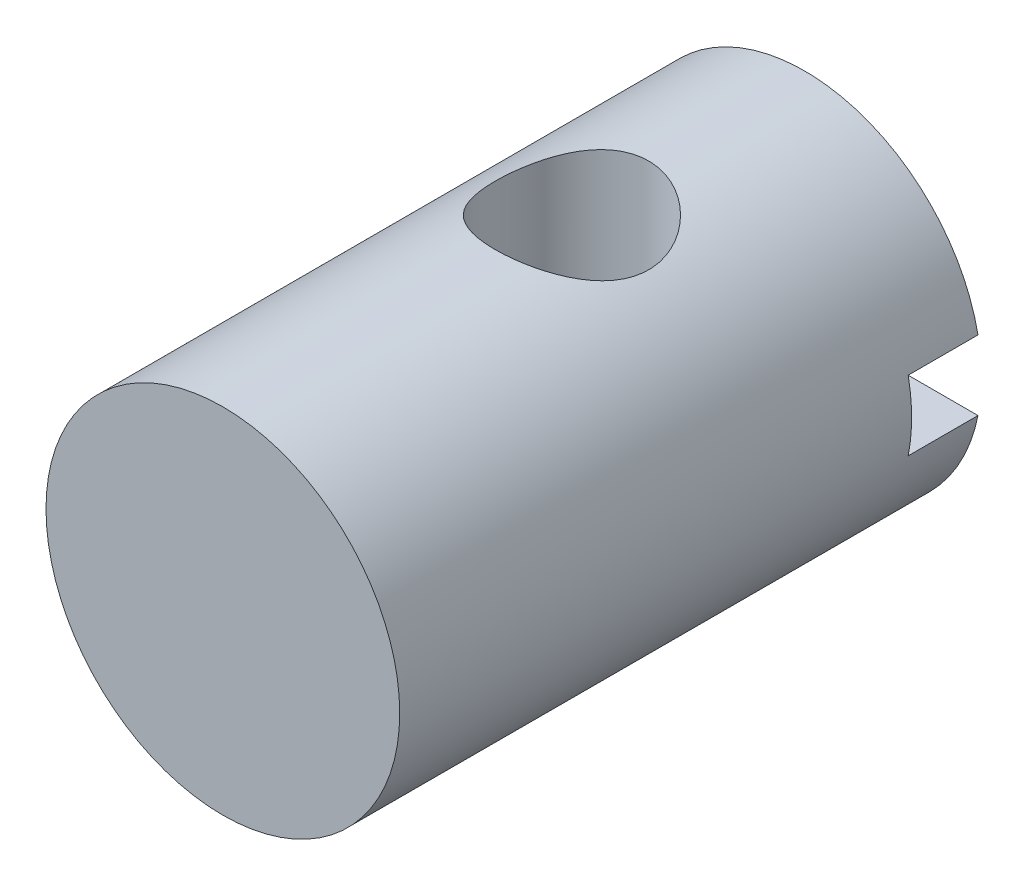
ISO-10303-21;
HEADER;
FILE_DESCRIPTION(('STEP AP214'),'2;1');
FILE_NAME('part.step','',(''),(''),'','','');
FILE_SCHEMA(('AUTOMOTIVE_DESIGN { 1 0 10303 214 1 1 1 1 }'));
ENDSEC;
DATA;
#1=APPLICATION_CONTEXT('core data for automotive mechanical design processes');
#2=APPLICATION_PROTOCOL_DEFINITION('international standard','automotive_design',2000,#1);
#3=PRODUCT_CONTEXT('',#1,'mechanical');
#4=PRODUCT('Part','Part','',(#3));
#5=PRODUCT_RELATED_PRODUCT_CATEGORY('part','',(#4));
#6=PRODUCT_DEFINITION_FORMATION('','',#4);
#7=PRODUCT_DEFINITION_CONTEXT('part definition',#1,'design');
#8=PRODUCT_DEFINITION('design','',#6,#7);
#9=PRODUCT_DEFINITION_SHAPE('','',#8);
#10=(LENGTH_UNIT() NAMED_UNIT(*) SI_UNIT(.MILLI.,.METRE.));
#11=(NAMED_UNIT(*) PLANE_ANGLE_UNIT() SI_UNIT($,.RADIAN.));
#12=(NAMED_UNIT(*) SI_UNIT($,.STERADIAN.) SOLID_ANGLE_UNIT());
#13=UNCERTAINTY_MEASURE_WITH_UNIT(LENGTH_MEASURE(1.E-05),#10,'distance_accuracy_value','');
#14=(GEOMETRIC_REPRESENTATION_CONTEXT(3) GLOBAL_UNCERTAINTY_ASSIGNED_CONTEXT((#13)) GLOBAL_UNIT_ASSIGNED_CONTEXT((#10,
#11,#12)) REPRESENTATION_CONTEXT('',''));
#15=CARTESIAN_POINT('',(0.,0.,0.));
#16=DIRECTION('',(0.,0.,1.));
#17=DIRECTION('',(1.,0.,0.));
#18=AXIS2_PLACEMENT_3D('',#15,#16,#17);
#19=CARTESIAN_POINT('',(10.,-1.21877816481073E-13,-12.5));
#20=DIRECTION('',(0.,0.,-1.));
#21=DIRECTION('',(-1.,0.,0.));
#22=AXIS2_PLACEMENT_3D('',#19,#20,#21);
#23=PLANE('',#22);
#24=CARTESIAN_POINT('',(10.,-1.21877816481073E-13,-12.5));
#25=DIRECTION('',(0.,0.,-1.));
#26=DIRECTION('',(-1.,0.,0.));
#27=AXIS2_PLACEMENT_3D('',#24,#25,#26);
#28=CIRCLE('',#27,3.80000000000001);
#29=CARTESIAN_POINT('',(6.27474833064932,-0.750000000000123,-12.5));
#30=VERTEX_POINT('',#29);
#31=CARTESIAN_POINT('',(6.27474833064932,0.749999999999877,-12.5));
#32=VERTEX_POINT('',#31);
#33=EDGE_CURVE('E107',#30,#32,#28,.T.);
#34=ORIENTED_EDGE('',*,*,#33,.T.);
#35=DIRECTION('',(-1.,0.,0.));
#36=VECTOR('',#35,1.);
#37=CARTESIAN_POINT('',(6.27474833064932,0.749999999999877,-12.5));
#38=LINE('',#37,#36);
#39=CARTESIAN_POINT('',(13.7252516693507,0.749999999999877,-12.5));
#40=VERTEX_POINT('',#39);
#41=EDGE_CURVE('E95',#40,#32,#38,.T.);
#42=ORIENTED_EDGE('',*,*,#41,.F.);
#43=CARTESIAN_POINT('',(13.7252516693507,-0.750000000000123,-12.5));
#44=VERTEX_POINT('',#43);
#45=EDGE_CURVE('E100',#40,#44,#28,.T.);
#46=ORIENTED_EDGE('',*,*,#45,.T.);
#47=DIRECTION('',(-1.,0.,0.));
#48=VECTOR('',#47,1.);
#49=CARTESIAN_POINT('',(13.7252516693507,-0.750000000000123,-12.5));
#50=LINE('',#49,#48);
#51=EDGE_CURVE('E110',#44,#30,#50,.T.);
#52=ORIENTED_EDGE('',*,*,#51,.T.);
#53=EDGE_LOOP('',(#34,#42,#46,#52));
#54=FACE_BOUND('',#53,.T.);
#55=ADVANCED_FACE('F39',(#54),#23,.T.);
#56=CARTESIAN_POINT('',(10.,0.,-1.5));
#57=DIRECTION('',(0.,0.,-1.));
#58=DIRECTION('',(-1.,0.,0.));
#59=AXIS2_PLACEMENT_3D('',#56,#57,#58);
#60=CYLINDRICAL_SURFACE('',#59,3.8);
#61=CARTESIAN_POINT('',(10.,-3.8,-7.35000000000001));
#62=CARTESIAN_POINT('',(9.91194957060179,-3.79999696122883,-7.35000376105629));
#63=CARTESIAN_POINT('',(9.82375596852797,-3.79690525102173,-7.35708953533736));
#64=CARTESIAN_POINT('',(9.64989447444809,-3.78484628206121,-7.38515720802473));
#65=CARTESIAN_POINT('',(9.56423340573726,-3.77586443713345,-7.40617360525367));
#66=CARTESIAN_POINT('',(9.39822755860205,-3.75298094804684,-7.46117370714911));
#67=CARTESIAN_POINT('',(9.31786530200433,-3.73909654926326,-7.49511198974543));
#68=CARTESIAN_POINT('',(9.16405934145177,-3.70774487563136,-7.57479463146301));
#69=CARTESIAN_POINT('',(9.09061387508503,-3.69027851709743,-7.62053597197164));
#70=CARTESIAN_POINT('',(8.94866849759499,-3.65244569529678,-7.72510833893519));
#71=CARTESIAN_POINT('',(8.88058703991105,-3.63197908529399,-7.7844707781314));
#72=CARTESIAN_POINT('',(8.75498049910838,-3.59086378625934,-7.91347380460032));
#73=CARTESIAN_POINT('',(8.69746142656976,-3.57021500052023,-7.98312020359853));
#74=CARTESIAN_POINT('',(8.59150528311732,-3.52980669380345,-8.1353054019922));
#75=CARTESIAN_POINT('',(8.54373385849682,-3.51015693528199,-8.21833991168769));
#76=CARTESIAN_POINT('',(8.46302267777711,-3.47557806909876,-8.39223805715567));
#77=CARTESIAN_POINT('',(8.43007463981952,-3.46064632686275,-8.48309728734618));
#78=CARTESIAN_POINT('',(8.38171070523258,-3.43828753033671,-8.66525020215803));
#79=CARTESIAN_POINT('',(8.36548608136198,-3.43051645375567,-8.75628520897929));
#80=CARTESIAN_POINT('',(8.34851135155017,-3.42237980381174,-8.94009143262827));
#81=CARTESIAN_POINT('',(8.34775161613728,-3.42200962216028,-9.03286153304499));
#82=CARTESIAN_POINT('',(8.36112290394406,-3.42842802645711,-9.2091138248349));
#83=CARTESIAN_POINT('',(8.3739994298507,-3.43461354518613,-9.2927177261447));
#84=CARTESIAN_POINT('',(8.41215980032079,-3.45241974380898,-9.45643346515836));
#85=CARTESIAN_POINT('',(8.43744627131958,-3.46404157421702,-9.53654455973653));
#86=CARTESIAN_POINT('',(8.50020856551411,-3.49167854017118,-9.69310810468767));
#87=CARTESIAN_POINT('',(8.53794101393258,-3.50778494811805,-9.76944083798345));
#88=CARTESIAN_POINT('',(8.62434091760118,-3.54255945204556,-9.91500452149728));
#89=CARTESIAN_POINT('',(8.6730128778195,-3.56122860214513,-9.9842325287825));
#90=CARTESIAN_POINT('',(8.7851900924795,-3.60112396893348,-10.1203644088009));
#91=CARTESIAN_POINT('',(8.84965114638618,-3.62242695031319,-10.1864605275403));
#92=CARTESIAN_POINT('',(8.9889343172611,-3.66374400577049,-10.3071888469564));
#93=CARTESIAN_POINT('',(9.06375928236581,-3.68375772331906,-10.3618178859151));
#94=CARTESIAN_POINT('',(9.22428137911509,-3.72091644153702,-10.4593877330871));
#95=CARTESIAN_POINT('',(9.31021764904183,-3.73796931751632,-10.5019728404656));
#96=CARTESIAN_POINT('',(9.48896484833733,-3.76656513526773,-10.5717931463465));
#97=CARTESIAN_POINT('',(9.58177160561211,-3.77811138973238,-10.5990375753345));
#98=CARTESIAN_POINT('',(9.76489870672464,-3.79375765961415,-10.6356498164065));
#99=CARTESIAN_POINT('',(9.85496417545699,-3.7983076048285,-10.6460999658065));
#100=CARTESIAN_POINT('',(10.0356706694591,-3.80090546422672,-10.6520873040471));
#101=CARTESIAN_POINT('',(10.126311501699,-3.79895545478831,-10.6476292552349));
#102=CARTESIAN_POINT('',(10.3003469998347,-3.78906043610529,-10.6246766883085));
#103=CARTESIAN_POINT('',(10.3838663314743,-3.78145032964028,-10.6069659748817));
#104=CARTESIAN_POINT('',(10.5466419665887,-3.76137104627712,-10.55912851329));
#105=CARTESIAN_POINT('',(10.6258977424523,-3.74890126956601,-10.5290002324396));
#106=CARTESIAN_POINT('',(10.7807027341313,-3.71979883625368,-10.4562103451627));
#107=CARTESIAN_POINT('',(10.8560587204487,-3.70304826667291,-10.4131864928896));
#108=CARTESIAN_POINT('',(10.9987534435706,-3.6671397800344,-10.3162222053639));
#109=CARTESIAN_POINT('',(11.0660887093196,-3.64798082804106,-10.2622770708718));
#110=CARTESIAN_POINT('',(11.1963075190736,-3.60747154631649,-10.1401398666561));
#111=CARTESIAN_POINT('',(11.25844556743,-3.58606625314232,-10.0711692326187));
#112=CARTESIAN_POINT('',(11.370500267622,-3.54475724827872,-9.92348457134284));
#113=CARTESIAN_POINT('',(11.4204132027389,-3.5248539945135,-9.84476759191198));
#114=CARTESIAN_POINT('',(11.5074169041307,-3.48854832432265,-9.6776692805197));
#115=CARTESIAN_POINT('',(11.5442337082505,-3.47222317671321,-9.58912722670923));
#116=CARTESIAN_POINT('',(11.6020972934124,-3.44591249648879,-9.40616230992947));
#117=CARTESIAN_POINT('',(11.6231585953032,-3.43592112773035,-9.31174494902468));
#118=CARTESIAN_POINT('',(11.6474137418092,-3.42435278494571,-9.12804896509271));
#119=CARTESIAN_POINT('',(11.651931119827,-3.4221530040061,-9.03898384088637));
#120=CARTESIAN_POINT('',(11.6465650447241,-3.42473848425087,-8.8614016316247));
#121=CARTESIAN_POINT('',(11.6366843068813,-3.42952242840528,-8.77288444639717));
#122=CARTESIAN_POINT('',(11.6039445850675,-3.44494678016484,-8.60394074098507));
#123=CARTESIAN_POINT('',(11.5818272752196,-3.45525152689614,-8.52333676423987));
#124=CARTESIAN_POINT('',(11.5260028925393,-3.48026515515702,-8.36698235778281));
#125=CARTESIAN_POINT('',(11.4922925056753,-3.49497529587013,-8.29123332327298));
#126=CARTESIAN_POINT('',(11.4118119725945,-3.52828487439683,-8.14153851440376));
#127=CARTESIAN_POINT('',(11.3643549300852,-3.5470704743158,-8.06800433176184));
#128=CARTESIAN_POINT('',(11.2586460503276,-3.585941922614,-7.92953072194666));
#129=CARTESIAN_POINT('',(11.2003899763017,-3.60602827929894,-7.86459468527959));
#130=CARTESIAN_POINT('',(11.069088005278,-3.64721222630943,-7.73967578918971));
#131=CARTESIAN_POINT('',(10.9952216289361,-3.66825792612275,-7.68053401761523));
#132=CARTESIAN_POINT('',(10.8378565951182,-3.70736572344266,-7.57541346468343));
#133=CARTESIAN_POINT('',(10.7543535912691,-3.72542646565262,-7.52944065568267));
#134=CARTESIAN_POINT('',(10.5810603781706,-3.75632940795092,-7.452833196212));
#135=CARTESIAN_POINT('',(10.4913702853963,-3.76923877829612,-7.42199982485397));
#136=CARTESIAN_POINT('',(10.3075315311509,-3.7886548572616,-7.37616380470646));
#137=CARTESIAN_POINT('',(10.2133975548868,-3.79518129224548,-7.36111237161482));
#138=CARTESIAN_POINT('',(10.0989835566138,-3.79876283337652,-7.35285159751909));
#139=CARTESIAN_POINT('',(10.0792067898749,-3.79922602205714,-7.35178318545424));
#140=CARTESIAN_POINT('',(10.0396224324793,-3.79984494852294,-7.35035696065378));
#141=CARTESIAN_POINT('',(10.0198148415768,-3.80000068384413,-7.34999915361306));
#142=CARTESIAN_POINT('',(10.,-3.8,-7.35000000000001));
#143=B_SPLINE_CURVE_WITH_KNOTS('',3,(#61,#62,#63,#64,#65,#66,#67,#68,#69,#70,#71,#72,#73,#74,
#75,#76,#77,#78,#79,#80,#81,#82,#83,#84,#85,#86,#87,#88,#89,#90,#91,#92,#93,#94,#95,#96,#97,#98,
#99,#100,#101,#102,#103,#104,#105,#106,#107,#108,#109,#110,#111,#112,#113,#114,#115,#116,#117,
#118,#119,#120,#121,#122,#123,#124,#125,#126,#127,#128,#129,#130,#131,#132,#133,#134,#135,#136,
#137,#138,#139,#140,#141,#142),.UNSPECIFIED.,.T.,.F.,(4,2,2,2,2,2,2,2,2,2,2,2,2,2,2,2,2,2,2,2,2,
2,2,2,2,2,2,2,2,2,2,2,2,2,2,2,2,2,2,2,4),(0.,0.264069598962706,0.528795614927436,
0.792599550160092,1.0563360847239,1.33299090186862,1.60980266628501,1.90169762765341,
2.19342930353264,2.47027677856788,2.7469518646116,3.00021692700501,3.25353561343495,
3.51244327900245,3.77145776056253,4.0544386023975,4.33749736588581,4.62820440131821,
4.91873633090972,5.18966148632497,5.46050010436105,5.7164740467613,5.97247959318635,
6.23648535071425,6.50060494773085,6.78512374264387,7.06972893081728,7.35997921153303,
7.64996165625496,7.91616517635584,8.18231850079117,8.43387159491259,8.68549665860563,
8.95291498992629,9.22043846022899,9.50986964913376,9.79943189311328,10.0850843423981,
10.3698511709923,10.4292768361596,10.4887029775703),.UNSPECIFIED.);
#144=CARTESIAN_POINT('',(10.,-3.8,-7.35000000000001));
#145=VERTEX_POINT('',#144);
#146=EDGE_CURVE('E11',#145,#145,#143,.T.);
#147=ORIENTED_EDGE('',*,*,#146,.F.);
#148=EDGE_LOOP('',(#147));
#149=FACE_BOUND('',#148,.T.);
#150=CARTESIAN_POINT('',(10.,3.79999999999988,-7.35000000000001));
#151=CARTESIAN_POINT('',(10.0880504293982,3.79999696122854,-7.35000376105629));
#152=CARTESIAN_POINT('',(10.176244031472,3.79690525102165,-7.35708953533736));
#153=CARTESIAN_POINT('',(10.3501055255519,3.78484628206129,-7.38515720802474));
#154=CARTESIAN_POINT('',(10.4357665942627,3.77586443713347,-7.40617360525367));
#155=CARTESIAN_POINT('',(10.601772441398,3.75298094804682,-7.46117370714911));
#156=CARTESIAN_POINT('',(10.6821346979957,3.73909654926326,-7.49511198974543));
#157=CARTESIAN_POINT('',(10.8359406585482,3.70774487563137,-7.57479463146301));
#158=CARTESIAN_POINT('',(10.909386124915,3.69027851709743,-7.62053597197164));
#159=CARTESIAN_POINT('',(11.051331502405,3.65244569529677,-7.72510833893519));
#160=CARTESIAN_POINT('',(11.119412960089,3.63197908529399,-7.78447077813141));
#161=CARTESIAN_POINT('',(11.2450195008916,3.59086378625934,-7.91347380460033));
#162=CARTESIAN_POINT('',(11.3025385734303,3.57021500052023,-7.98312020359854));
#163=CARTESIAN_POINT('',(11.4084947168827,3.52980669380345,-8.13530540199221));
#164=CARTESIAN_POINT('',(11.4562661415032,3.51015693528199,-8.2183399116877));
#165=CARTESIAN_POINT('',(11.5369773222229,3.47557806909876,-8.39223805715569));
#166=CARTESIAN_POINT('',(11.5699253601805,3.46064632686275,-8.4830972873462));
#167=CARTESIAN_POINT('',(11.6182892947674,3.4382875303367,-8.66525020215804));
#168=CARTESIAN_POINT('',(11.634513918638,3.43051645375567,-8.7562852089793));
#169=CARTESIAN_POINT('',(11.6514886484498,3.42237980381174,-8.94009143262829));
#170=CARTESIAN_POINT('',(11.6522483838627,3.42200962216029,-9.032861533045));
#171=CARTESIAN_POINT('',(11.6388770960559,3.42842802645711,-9.20911382483491));
#172=CARTESIAN_POINT('',(11.6260005701493,3.43461354518613,-9.29271772614471));
#173=CARTESIAN_POINT('',(11.5878401996792,3.45241974380898,-9.45643346515837));
#174=CARTESIAN_POINT('',(11.5625537286804,3.46404157421702,-9.53654455973654));
#175=CARTESIAN_POINT('',(11.4997914344859,3.49167854017118,-9.69310810468768));
#176=CARTESIAN_POINT('',(11.4620589860674,3.50778494811805,-9.76944083798346));
#177=CARTESIAN_POINT('',(11.3756590823988,3.54255945204557,-9.91500452149729));
#178=CARTESIAN_POINT('',(11.3269871221805,3.56122860214513,-9.9842325287825));
#179=CARTESIAN_POINT('',(11.2148099075205,3.60112396893348,-10.1203644088009));
#180=CARTESIAN_POINT('',(11.1503488536138,3.6224269503132,-10.1864605275403));
#181=CARTESIAN_POINT('',(11.0110656827389,3.66374400577049,-10.3071888469564));
#182=CARTESIAN_POINT('',(10.9362407176342,3.68375772331907,-10.3618178859151));
#183=CARTESIAN_POINT('',(10.7757186208849,3.72091644153702,-10.4593877330871));
#184=CARTESIAN_POINT('',(10.6897823509582,3.73796931751632,-10.5019728404656));
#185=CARTESIAN_POINT('',(10.5110351516627,3.76656513526774,-10.5717931463465));
#186=CARTESIAN_POINT('',(10.4182283943879,3.77811138973239,-10.5990375753345));
#187=CARTESIAN_POINT('',(10.2351012932754,3.79375765961415,-10.6356498164065));
#188=CARTESIAN_POINT('',(10.145035824543,3.7983076048285,-10.6460999658065));
#189=CARTESIAN_POINT('',(9.96432933054085,3.80090546422672,-10.6520873040471));
#190=CARTESIAN_POINT('',(9.87368849830103,3.79895545478831,-10.6476292552349));
#191=CARTESIAN_POINT('',(9.69965300016529,3.78906043610529,-10.6246766883085));
#192=CARTESIAN_POINT('',(9.61613366852574,3.78145032964028,-10.6069659748817));
#193=CARTESIAN_POINT('',(9.45335803341129,3.76137104627711,-10.55912851329));
#194=CARTESIAN_POINT('',(9.37410225754769,3.74890126956601,-10.5290002324396));
#195=CARTESIAN_POINT('',(9.21929726586867,3.71979883625367,-10.4562103451627));
#196=CARTESIAN_POINT('',(9.1439412795513,3.70304826667291,-10.4131864928896));
#197=CARTESIAN_POINT('',(9.00124655642939,3.6671397800344,-10.3162222053639));
#198=CARTESIAN_POINT('',(8.93391129068036,3.64798082804106,-10.2622770708718));
#199=CARTESIAN_POINT('',(8.80369248092634,3.60747154631649,-10.140139866656));
#200=CARTESIAN_POINT('',(8.74155443257004,3.58606625314232,-10.0711692326187));
#201=CARTESIAN_POINT('',(8.62949973237799,3.54475724827871,-9.92348457134283));
#202=CARTESIAN_POINT('',(8.57958679726107,3.5248539945135,-9.84476759191197));
#203=CARTESIAN_POINT('',(8.49258309586931,3.48854832432264,-9.67766928051969));
#204=CARTESIAN_POINT('',(8.45576629174952,3.4722231767132,-9.58912722670922));
#205=CARTESIAN_POINT('',(8.39790270658764,3.44591249648879,-9.40616230992946));
#206=CARTESIAN_POINT('',(8.37684140469676,3.43592112773034,-9.31174494902467));
#207=CARTESIAN_POINT('',(8.35258625819082,3.42435278494571,-9.1280489650927));
#208=CARTESIAN_POINT('',(8.34806888017304,3.4221530040061,-9.03898384088636));
#209=CARTESIAN_POINT('',(8.35343495527594,3.42473848425087,-8.86140163162468));
#210=CARTESIAN_POINT('',(8.36331569311867,3.42952242840528,-8.77288444639716));
#211=CARTESIAN_POINT('',(8.39605541493254,3.44494678016484,-8.60394074098506));
#212=CARTESIAN_POINT('',(8.41817272478037,3.45525152689614,-8.52333676423986));
#213=CARTESIAN_POINT('',(8.47399710746071,3.48026515515702,-8.36698235778281));
#214=CARTESIAN_POINT('',(8.50770749432471,3.49497529587014,-8.29123332327297));
#215=CARTESIAN_POINT('',(8.58818802740547,3.52828487439684,-8.14153851440375));
#216=CARTESIAN_POINT('',(8.63564506991485,3.54707047431581,-8.06800433176183));
#217=CARTESIAN_POINT('',(8.74135394967244,3.58594192261401,-7.92953072194665));
#218=CARTESIAN_POINT('',(8.79961002369829,3.60602827929894,-7.86459468527958));
#219=CARTESIAN_POINT('',(8.930911994722,3.64721222630944,-7.7396757891897));
#220=CARTESIAN_POINT('',(9.00477837106393,3.66825792612275,-7.68053401761523));
#221=CARTESIAN_POINT('',(9.16214340488184,3.70736572344266,-7.57541346468343));
#222=CARTESIAN_POINT('',(9.24564640873094,3.72542646565262,-7.52944065568266));
#223=CARTESIAN_POINT('',(9.41893962182938,3.75632940795093,-7.452833196212));
#224=CARTESIAN_POINT('',(9.50862971460376,3.76923877829613,-7.42199982485397));
#225=CARTESIAN_POINT('',(9.69246846884913,3.78865485726159,-7.37616380470645));
#226=CARTESIAN_POINT('',(9.78660244511324,3.79518129224543,-7.36111237161482));
#227=CARTESIAN_POINT('',(9.90101644338625,3.79876283337653,-7.35285159751909));
#228=CARTESIAN_POINT('',(9.92079321012511,3.79922602205717,-7.35178318545423));
#229=CARTESIAN_POINT('',(9.96037756752073,3.79984494852291,-7.35035696065378));
#230=CARTESIAN_POINT('',(9.98018515842325,3.80000068384405,-7.34999915361306));
#231=CARTESIAN_POINT('',(10.,3.79999999999988,-7.35000000000001));
#232=B_SPLINE_CURVE_WITH_KNOTS('',3,(#150,#151,#152,#153,#154,#155,#156,#157,#158,#159,#160,
#161,#162,#163,#164,#165,#166,#167,#168,#169,#170,#171,#172,#173,#174,#175,#176,#177,#178,#179,
#180,#181,#182,#183,#184,#185,#186,#187,#188,#189,#190,#191,#192,#193,#194,#195,#196,#197,#198,
#199,#200,#201,#202,#203,#204,#205,#206,#207,#208,#209,#210,#211,#212,#213,#214,#215,#216,#217,
#218,#219,#220,#221,#222,#223,#224,#225,#226,#227,#228,#229,#230,#231),.UNSPECIFIED.,.T.,.F.,(4,
2,2,2,2,2,2,2,2,2,2,2,2,2,2,2,2,2,2,2,2,2,2,2,2,2,2,2,2,2,2,2,2,2,2,2,2,2,2,2,4),(0.,
0.264069598962716,0.528795614927438,0.792599550160092,1.0563360847239,1.33299090186863,
1.60980266628502,1.90169762765342,2.19342930353265,2.47027677856788,2.7469518646116,
3.00021692700502,3.25353561343496,3.51244327900246,3.77145776056254,4.05443860239751,
4.33749736588582,4.62820440131821,4.91873633090973,5.18966148632497,5.46050010436105,
5.7164740467613,5.97247959318636,6.23648535071425,6.50060494773086,6.78512374264388,
7.06972893081729,7.35997921153304,7.64996165625496,7.91616517635585,8.18231850079118,
8.43387159491259,8.68549665860563,8.95291498992629,9.220438460229,9.50986964913377,
9.79943189311328,10.0850843423981,10.3698511709923,10.4292768361596,10.4887029775703),.UNSPECIFIED.);
#233=CARTESIAN_POINT('',(10.,3.79999999999988,-7.35000000000001));
#234=VERTEX_POINT('',#233);
#235=EDGE_CURVE('E52',#234,#234,#232,.T.);
#236=ORIENTED_EDGE('',*,*,#235,.F.);
#237=EDGE_LOOP('',(#236));
#238=FACE_BOUND('',#237,.T.);
#239=DIRECTION('',(0.,0.,-1.));
#240=VECTOR('',#239,1.);
#241=CARTESIAN_POINT('',(6.27474833064932,-0.750000000000123,-12.5));
#242=LINE('',#241,#240);
#243=CARTESIAN_POINT('',(6.27474833064932,-0.750000000000123,-14.));
#244=VERTEX_POINT('',#243);
#245=EDGE_CURVE('E113',#30,#244,#242,.T.);
#246=ORIENTED_EDGE('',*,*,#245,.T.);
#247=CARTESIAN_POINT('',(10.,0.,-14.));
#248=DIRECTION('',(0.,0.,-1.));
#249=DIRECTION('',(-1.,0.,0.));
#250=AXIS2_PLACEMENT_3D('',#247,#248,#249);
#251=CIRCLE('',#250,3.8);
#252=CARTESIAN_POINT('',(13.7252516693507,-0.750000000000123,-14.));
#253=VERTEX_POINT('',#252);
#254=EDGE_CURVE('E115',#253,#244,#251,.T.);
#255=ORIENTED_EDGE('',*,*,#254,.F.);
#256=DIRECTION('',(0.,0.,-1.));
#257=VECTOR('',#256,1.);
#258=CARTESIAN_POINT('',(13.7252516693507,-0.750000000000123,-12.5));
#259=LINE('',#258,#257);
#260=EDGE_CURVE('E67',#44,#253,#259,.T.);
#261=ORIENTED_EDGE('',*,*,#260,.F.);
#262=ORIENTED_EDGE('',*,*,#45,.F.);
#263=DIRECTION('',(0.,0.,1.));
#264=VECTOR('',#263,1.);
#265=CARTESIAN_POINT('',(13.7252516693507,0.749999999999877,-14.));
#266=LINE('',#265,#264);
#267=CARTESIAN_POINT('',(13.7252516693507,0.749999999999877,-14.));
#268=VERTEX_POINT('',#267);
#269=EDGE_CURVE('E59',#268,#40,#266,.T.);
#270=ORIENTED_EDGE('',*,*,#269,.F.);
#271=CARTESIAN_POINT('',(10.,-1.21877816481073E-13,-14.));
#272=DIRECTION('',(0.,0.,-1.));
#273=DIRECTION('',(1.,0.,0.));
#274=AXIS2_PLACEMENT_3D('',#271,#272,#273);
#275=CIRCLE('',#274,3.80000000000001);
#276=CARTESIAN_POINT('',(6.27474833064932,0.749999999999877,-14.));
#277=VERTEX_POINT('',#276);
#278=EDGE_CURVE('E91',#277,#268,#275,.T.);
#279=ORIENTED_EDGE('',*,*,#278,.F.);
#280=DIRECTION('',(0.,0.,1.));
#281=VECTOR('',#280,1.);
#282=CARTESIAN_POINT('',(6.27474833064932,0.749999999999877,-14.));
#283=LINE('',#282,#281);
#284=EDGE_CURVE('E88',#277,#32,#283,.T.);
#285=ORIENTED_EDGE('',*,*,#284,.T.);
#286=ORIENTED_EDGE('',*,*,#33,.F.);
#287=EDGE_LOOP('',(#246,#255,#261,#262,#270,#279,#285,#286));
#288=FACE_BOUND('',#287,.T.);
#289=CARTESIAN_POINT('',(10.,0.,-1.5));
#290=DIRECTION('',(0.,0.,-1.));
#291=DIRECTION('',(-1.,0.,0.));
#292=AXIS2_PLACEMENT_3D('',#289,#290,#291);
#293=CIRCLE('',#292,3.8);
#294=CARTESIAN_POINT('',(6.2,0.,-1.5));
#295=VERTEX_POINT('',#294);
#296=EDGE_CURVE('E119',#295,#295,#293,.T.);
#297=ORIENTED_EDGE('',*,*,#296,.T.);
#298=EDGE_LOOP('',(#297));
#299=FACE_BOUND('',#298,.T.);
#300=ADVANCED_FACE('F41',(#149,#238,#288,#299),#60,.T.);
#301=CARTESIAN_POINT('',(13.8,0.,-1.5));
#302=DIRECTION('',(0.,0.,1.));
#303=DIRECTION('',(1.,0.,0.));
#304=AXIS2_PLACEMENT_3D('',#301,#302,#303);
#305=PLANE('',#304);
#306=ORIENTED_EDGE('',*,*,#296,.F.);
#307=EDGE_LOOP('',(#306));
#308=FACE_BOUND('',#307,.T.);
#309=ADVANCED_FACE('F143',(#308),#305,.T.);
#310=CARTESIAN_POINT('',(10.,0.,-14.));
#311=DIRECTION('',(0.,0.,-1.));
#312=DIRECTION('',(-1.,0.,0.));
#313=AXIS2_PLACEMENT_3D('',#310,#311,#312);
#314=PLANE('',#313);
#315=DIRECTION('',(-1.,0.,0.));
#316=VECTOR('',#315,1.);
#317=CARTESIAN_POINT('',(13.7252516693507,-0.750000000000123,-14.));
#318=LINE('',#317,#316);
#319=EDGE_CURVE('E101',#253,#244,#318,.T.);
#320=ORIENTED_EDGE('',*,*,#319,.F.);
#321=ORIENTED_EDGE('',*,*,#254,.T.);
#322=EDGE_LOOP('',(#320,#321));
#323=FACE_BOUND('',#322,.T.);
#324=ADVANCED_FACE('F141',(#323),#314,.T.);
#325=CARTESIAN_POINT('',(13.7252516693507,-0.750000000000123,-12.5));
#326=DIRECTION('',(0.,-1.,0.));
#327=DIRECTION('',(0.,0.,-1.));
#328=AXIS2_PLACEMENT_3D('',#325,#326,#327);
#329=PLANE('',#328);
#330=ORIENTED_EDGE('',*,*,#319,.T.);
#331=ORIENTED_EDGE('',*,*,#245,.F.);
#332=ORIENTED_EDGE('',*,*,#51,.F.);
#333=ORIENTED_EDGE('',*,*,#260,.T.);
#334=EDGE_LOOP('',(#330,#331,#332,#333));
#335=FACE_BOUND('',#334,.T.);
#336=ADVANCED_FACE('F135',(#335),#329,.F.);
#337=CARTESIAN_POINT('',(6.27474833064932,0.749999999999877,-14.));
#338=DIRECTION('',(0.,1.,0.));
#339=DIRECTION('',(0.,0.,1.));
#340=AXIS2_PLACEMENT_3D('',#337,#338,#339);
#341=PLANE('',#340);
#342=ORIENTED_EDGE('',*,*,#41,.T.);
#343=ORIENTED_EDGE('',*,*,#284,.F.);
#344=DIRECTION('',(-1.,0.,0.));
#345=VECTOR('',#344,1.);
#346=CARTESIAN_POINT('',(6.27474833064932,0.749999999999877,-14.));
#347=LINE('',#346,#345);
#348=EDGE_CURVE('E84',#268,#277,#347,.T.);
#349=ORIENTED_EDGE('',*,*,#348,.F.);
#350=ORIENTED_EDGE('',*,*,#269,.T.);
#351=EDGE_LOOP('',(#342,#343,#349,#350));
#352=FACE_BOUND('',#351,.T.);
#353=ADVANCED_FACE('F86',(#352),#341,.F.);
#354=CARTESIAN_POINT('',(10.,-1.21877816481073E-13,-14.));
#355=DIRECTION('',(0.,0.,1.));
#356=DIRECTION('',(1.,0.,0.));
#357=AXIS2_PLACEMENT_3D('',#354,#355,#356);
#358=PLANE('',#357);
#359=ORIENTED_EDGE('',*,*,#278,.T.);
#360=ORIENTED_EDGE('',*,*,#348,.T.);
#361=EDGE_LOOP('',(#359,#360));
#362=FACE_BOUND('',#361,.T.);
#363=ADVANCED_FACE('F93',(#362),#358,.F.);
#364=CARTESIAN_POINT('',(10.,3.79999999999988,-9.));
#365=DIRECTION('',(0.,1.,0.));
#366=DIRECTION('',(0.,0.,1.));
#367=AXIS2_PLACEMENT_3D('',#364,#365,#366);
#368=CYLINDRICAL_SURFACE('',#367,1.64999999999999);
#369=ORIENTED_EDGE('',*,*,#146,.T.);
#370=EDGE_LOOP('',(#369));
#371=FACE_BOUND('',#370,.T.);
#372=ORIENTED_EDGE('',*,*,#235,.T.);
#373=EDGE_LOOP('',(#372));
#374=FACE_BOUND('',#373,.T.);
#375=ADVANCED_FACE('F125',(#371,#374),#368,.F.);
#376=CLOSED_SHELL('',(#55,#300,#309,#324,#336,#353,#363,#375));
#377=MANIFOLD_SOLID_BREP('B2',#376);
#378=ADVANCED_BREP_SHAPE_REPRESENTATION('',(#18,#377),#14);
#379=SHAPE_DEFINITION_REPRESENTATION(#9,#378);
ENDSEC;
END-ISO-10303-21;
